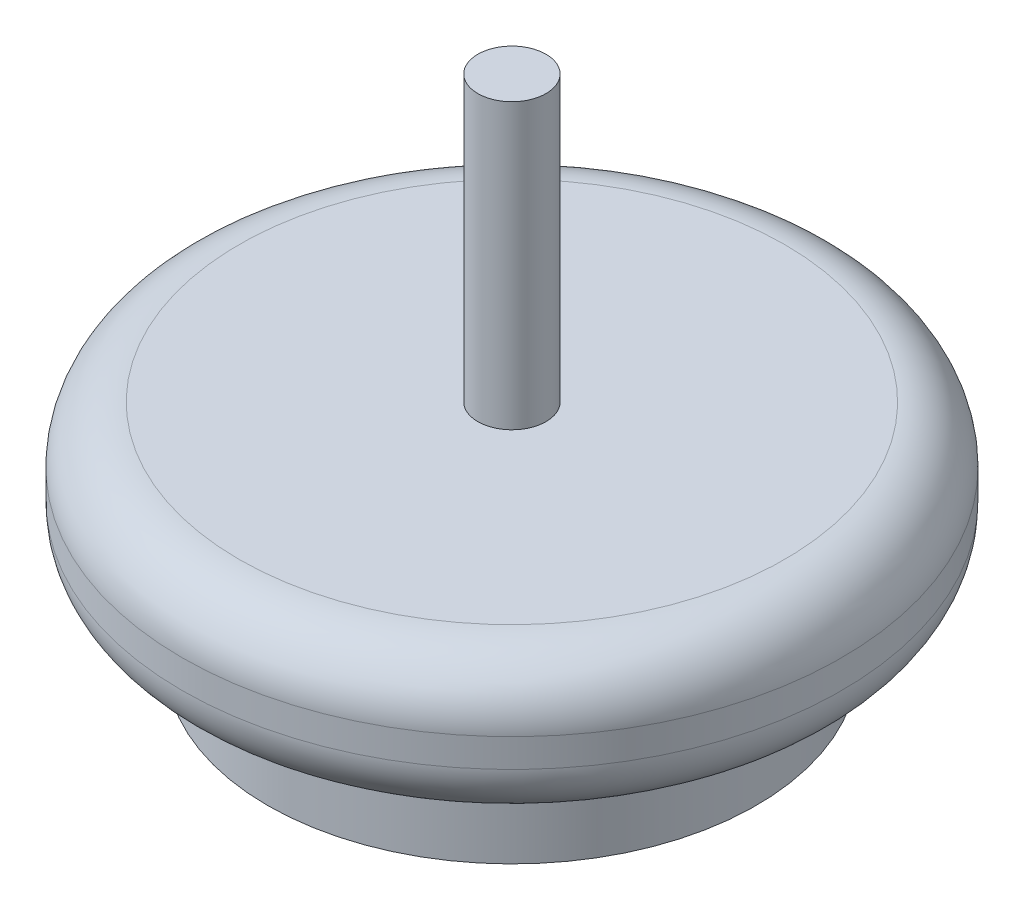
ISO-10303-21;
HEADER;
FILE_DESCRIPTION(('STEP AP214'),'2;1');
FILE_NAME('part.step','',(''),(''),'','','');
FILE_SCHEMA(('AUTOMOTIVE_DESIGN { 1 0 10303 214 1 1 1 1 }'));
ENDSEC;
DATA;
#1=APPLICATION_CONTEXT('core data for automotive mechanical design processes');
#2=APPLICATION_PROTOCOL_DEFINITION('international standard','automotive_design',2000,#1);
#3=PRODUCT_CONTEXT('',#1,'mechanical');
#4=PRODUCT('Part','Part','',(#3));
#5=PRODUCT_RELATED_PRODUCT_CATEGORY('part','',(#4));
#6=PRODUCT_DEFINITION_FORMATION('','',#4);
#7=PRODUCT_DEFINITION_CONTEXT('part definition',#1,'design');
#8=PRODUCT_DEFINITION('design','',#6,#7);
#9=PRODUCT_DEFINITION_SHAPE('','',#8);
#10=(LENGTH_UNIT() NAMED_UNIT(*) SI_UNIT(.MILLI.,.METRE.));
#11=(NAMED_UNIT(*) PLANE_ANGLE_UNIT() SI_UNIT($,.RADIAN.));
#12=(NAMED_UNIT(*) SI_UNIT($,.STERADIAN.) SOLID_ANGLE_UNIT());
#13=UNCERTAINTY_MEASURE_WITH_UNIT(LENGTH_MEASURE(1.E-05),#10,'distance_accuracy_value','');
#14=(GEOMETRIC_REPRESENTATION_CONTEXT(3) GLOBAL_UNCERTAINTY_ASSIGNED_CONTEXT((#13)) GLOBAL_UNIT_ASSIGNED_CONTEXT((#10,
#11,#12)) REPRESENTATION_CONTEXT('',''));
#15=CARTESIAN_POINT('',(0.,0.,0.));
#16=DIRECTION('',(0.,0.,1.));
#17=DIRECTION('',(1.,0.,0.));
#18=AXIS2_PLACEMENT_3D('',#15,#16,#17);
#19=CARTESIAN_POINT('',(0.,25.,0.));
#20=DIRECTION('',(0.,1.,0.));
#21=DIRECTION('',(0.,0.,1.));
#22=AXIS2_PLACEMENT_3D('',#19,#20,#21);
#23=PLANE('',#22);
#24=CARTESIAN_POINT('',(0.,25.,0.));
#25=DIRECTION('',(0.,1.,0.));
#26=DIRECTION('',(0.,0.,1.));
#27=AXIS2_PLACEMENT_3D('',#24,#25,#26);
#28=CIRCLE('',#27,48.);
#29=CARTESIAN_POINT('',(0.,25.,48.));
#30=VERTEX_POINT('',#29);
#31=EDGE_CURVE('E46',#30,#30,#28,.T.);
#32=ORIENTED_EDGE('',*,*,#31,.T.);
#33=EDGE_LOOP('',(#32));
#34=FACE_BOUND('',#33,.T.);
#35=CARTESIAN_POINT('',(0.,25.,0.));
#36=DIRECTION('',(0.,1.,0.));
#37=DIRECTION('',(0.,0.,1.));
#38=AXIS2_PLACEMENT_3D('',#35,#36,#37);
#39=CIRCLE('',#38,6.);
#40=CARTESIAN_POINT('',(0.,25.,6.));
#41=VERTEX_POINT('',#40);
#42=EDGE_CURVE('E58',#41,#41,#39,.T.);
#43=ORIENTED_EDGE('',*,*,#42,.F.);
#44=EDGE_LOOP('',(#43));
#45=FACE_BOUND('',#44,.T.);
#46=ADVANCED_FACE('F31',(#34,#45),#23,.T.);
#47=CARTESIAN_POINT('',(0.,25.,0.));
#48=DIRECTION('',(0.,-1.,0.));
#49=DIRECTION('',(0.,0.,-1.));
#50=AXIS2_PLACEMENT_3D('',#47,#48,#49);
#51=CYLINDRICAL_SURFACE('',#50,58.);
#52=CARTESIAN_POINT('',(0.,15.,0.));
#53=DIRECTION('',(0.,1.,0.));
#54=DIRECTION('',(0.,0.,1.));
#55=AXIS2_PLACEMENT_3D('',#52,#53,#54);
#56=CIRCLE('',#55,58.);
#57=CARTESIAN_POINT('',(0.,15.,58.));
#58=VERTEX_POINT('',#57);
#59=EDGE_CURVE('E38',#58,#58,#56,.F.);
#60=ORIENTED_EDGE('',*,*,#59,.T.);
#61=EDGE_LOOP('',(#60));
#62=FACE_BOUND('',#61,.T.);
#63=CARTESIAN_POINT('',(0.,10.,0.));
#64=DIRECTION('',(0.,1.,0.));
#65=DIRECTION('',(0.,0.,1.));
#66=AXIS2_PLACEMENT_3D('',#63,#64,#65);
#67=CIRCLE('',#66,58.);
#68=CARTESIAN_POINT('',(0.,10.,58.));
#69=VERTEX_POINT('',#68);
#70=EDGE_CURVE('E42',#69,#69,#67,.T.);
#71=ORIENTED_EDGE('',*,*,#70,.T.);
#72=EDGE_LOOP('',(#71));
#73=FACE_BOUND('',#72,.T.);
#74=ADVANCED_FACE('F73',(#62,#73),#51,.T.);
#75=CARTESIAN_POINT('',(0.,0.,0.));
#76=DIRECTION('',(0.,1.,0.));
#77=DIRECTION('',(0.,0.,1.));
#78=AXIS2_PLACEMENT_3D('',#75,#76,#77);
#79=PLANE('',#78);
#80=CARTESIAN_POINT('',(0.,0.,0.));
#81=DIRECTION('',(0.,1.,0.));
#82=DIRECTION('',(0.,0.,1.));
#83=AXIS2_PLACEMENT_3D('',#80,#81,#82);
#84=CIRCLE('',#83,48.);
#85=CARTESIAN_POINT('',(0.,0.,48.));
#86=VERTEX_POINT('',#85);
#87=EDGE_CURVE('E10',#86,#86,#84,.F.);
#88=ORIENTED_EDGE('',*,*,#87,.T.);
#89=EDGE_LOOP('',(#88));
#90=FACE_BOUND('',#89,.T.);
#91=CARTESIAN_POINT('',(0.,0.,0.));
#92=DIRECTION('',(0.,1.,0.));
#93=DIRECTION('',(0.,0.,1.));
#94=AXIS2_PLACEMENT_3D('',#91,#92,#93);
#95=CIRCLE('',#94,43.);
#96=CARTESIAN_POINT('',(0.,0.,43.));
#97=VERTEX_POINT('',#96);
#98=EDGE_CURVE('E52',#97,#97,#95,.T.);
#99=ORIENTED_EDGE('',*,*,#98,.T.);
#100=EDGE_LOOP('',(#99));
#101=FACE_BOUND('',#100,.T.);
#102=ADVANCED_FACE('F79',(#90,#101),#79,.F.);
#103=CARTESIAN_POINT('',(0.,-15.,0.));
#104=DIRECTION('',(0.,1.,0.));
#105=DIRECTION('',(0.,0.,1.));
#106=AXIS2_PLACEMENT_3D('',#103,#104,#105);
#107=CYLINDRICAL_SURFACE('',#106,43.);
#108=CARTESIAN_POINT('',(0.,-15.,0.));
#109=DIRECTION('',(0.,1.,0.));
#110=DIRECTION('',(0.,0.,1.));
#111=AXIS2_PLACEMENT_3D('',#108,#109,#110);
#112=CIRCLE('',#111,43.);
#113=CARTESIAN_POINT('',(0.,-15.,43.));
#114=VERTEX_POINT('',#113);
#115=EDGE_CURVE('E51',#114,#114,#112,.T.);
#116=ORIENTED_EDGE('',*,*,#115,.T.);
#117=EDGE_LOOP('',(#116));
#118=FACE_BOUND('',#117,.T.);
#119=ORIENTED_EDGE('',*,*,#98,.F.);
#120=EDGE_LOOP('',(#119));
#121=FACE_BOUND('',#120,.T.);
#122=ADVANCED_FACE('F83',(#118,#121),#107,.T.);
#123=CARTESIAN_POINT('',(0.,-15.,0.));
#124=DIRECTION('',(0.,1.,0.));
#125=DIRECTION('',(0.,0.,1.));
#126=AXIS2_PLACEMENT_3D('',#123,#124,#125);
#127=PLANE('',#126);
#128=ORIENTED_EDGE('',*,*,#115,.F.);
#129=EDGE_LOOP('',(#128));
#130=FACE_BOUND('',#129,.T.);
#131=ADVANCED_FACE('F88',(#130),#127,.F.);
#132=CARTESIAN_POINT('',(0.,15.,0.));
#133=DIRECTION('',(0.,1.,0.));
#134=DIRECTION('',(0.,0.,1.));
#135=AXIS2_PLACEMENT_3D('',#132,#133,#134);
#136=TOROIDAL_SURFACE('',#135,48.,10.);
#137=ORIENTED_EDGE('',*,*,#59,.F.);
#138=EDGE_LOOP('',(#137));
#139=FACE_BOUND('',#138,.T.);
#140=ORIENTED_EDGE('',*,*,#31,.F.);
#141=EDGE_LOOP('',(#140));
#142=FACE_BOUND('',#141,.T.);
#143=ADVANCED_FACE('F86',(#139,#142),#136,.T.);
#144=CARTESIAN_POINT('',(0.,10.,0.));
#145=DIRECTION('',(0.,1.,0.));
#146=DIRECTION('',(0.,0.,1.));
#147=AXIS2_PLACEMENT_3D('',#144,#145,#146);
#148=TOROIDAL_SURFACE('',#147,48.,10.);
#149=ORIENTED_EDGE('',*,*,#87,.F.);
#150=EDGE_LOOP('',(#149));
#151=FACE_BOUND('',#150,.T.);
#152=ORIENTED_EDGE('',*,*,#70,.F.);
#153=EDGE_LOOP('',(#152));
#154=FACE_BOUND('',#153,.T.);
#155=ADVANCED_FACE('F33',(#151,#154),#148,.T.);
#156=CARTESIAN_POINT('',(0.,75.,0.));
#157=DIRECTION('',(0.,-1.,0.));
#158=DIRECTION('',(0.,0.,-1.));
#159=AXIS2_PLACEMENT_3D('',#156,#157,#158);
#160=CYLINDRICAL_SURFACE('',#159,6.);
#161=CARTESIAN_POINT('',(0.,75.,0.));
#162=DIRECTION('',(0.,1.,0.));
#163=DIRECTION('',(0.,0.,1.));
#164=AXIS2_PLACEMENT_3D('',#161,#162,#163);
#165=CIRCLE('',#164,6.);
#166=CARTESIAN_POINT('',(0.,75.,6.));
#167=VERTEX_POINT('',#166);
#168=EDGE_CURVE('E55',#167,#167,#165,.T.);
#169=ORIENTED_EDGE('',*,*,#168,.F.);
#170=EDGE_LOOP('',(#169));
#171=FACE_BOUND('',#170,.T.);
#172=ORIENTED_EDGE('',*,*,#42,.T.);
#173=EDGE_LOOP('',(#172));
#174=FACE_BOUND('',#173,.T.);
#175=ADVANCED_FACE('F66',(#171,#174),#160,.T.);
#176=CARTESIAN_POINT('',(0.,75.,0.));
#177=DIRECTION('',(0.,1.,0.));
#178=DIRECTION('',(0.,0.,1.));
#179=AXIS2_PLACEMENT_3D('',#176,#177,#178);
#180=PLANE('',#179);
#181=ORIENTED_EDGE('',*,*,#168,.T.);
#182=EDGE_LOOP('',(#181));
#183=FACE_BOUND('',#182,.T.);
#184=ADVANCED_FACE('F64',(#183),#180,.T.);
#185=CLOSED_SHELL('',(#46,#74,#102,#122,#131,#143,#155,#175,#184));
#186=MANIFOLD_SOLID_BREP('B2',#185);
#187=ADVANCED_BREP_SHAPE_REPRESENTATION('',(#18,#186),#14);
#188=SHAPE_DEFINITION_REPRESENTATION(#9,#187);
ENDSEC;
END-ISO-10303-21;
